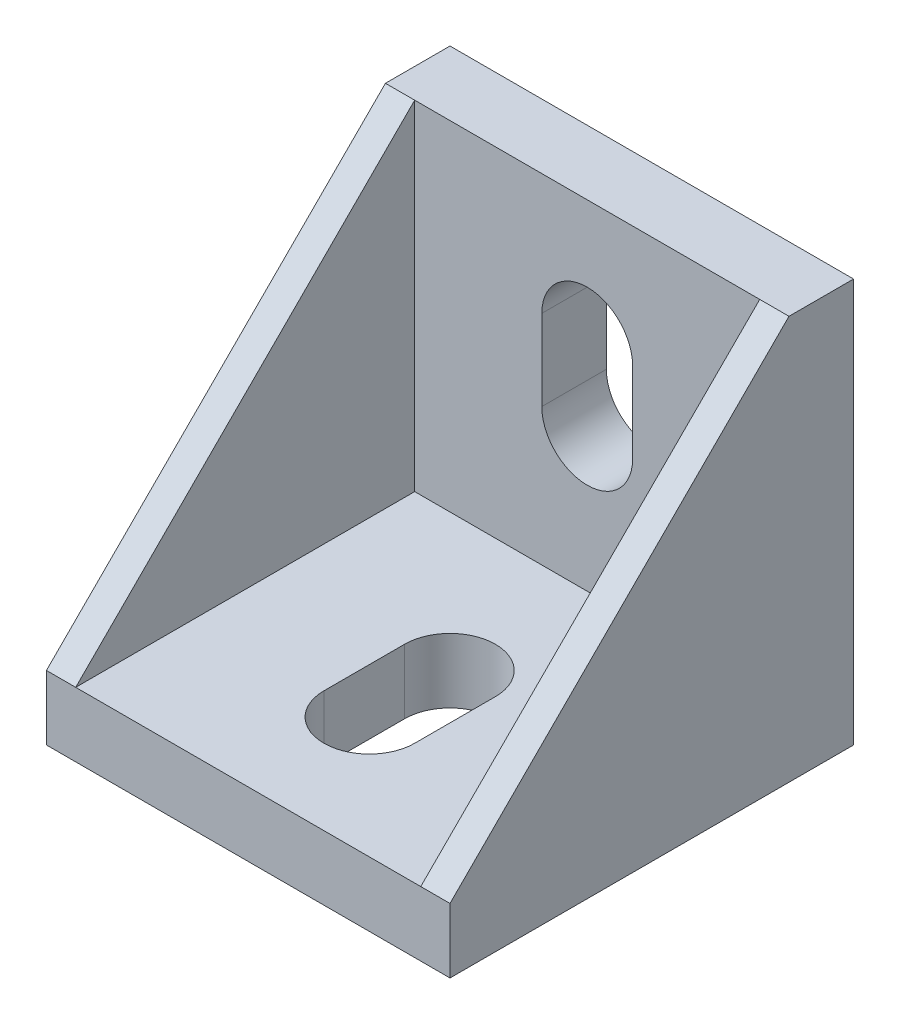
ISO-10303-21;
HEADER;
FILE_DESCRIPTION(('STEP AP214'),'2;1');
FILE_NAME('part.step','',(''),(''),'','','');
FILE_SCHEMA(('AUTOMOTIVE_DESIGN { 1 0 10303 214 1 1 1 1 }'));
ENDSEC;
DATA;
#1=APPLICATION_CONTEXT('core data for automotive mechanical design processes');
#2=APPLICATION_PROTOCOL_DEFINITION('international standard','automotive_design',2000,#1);
#3=PRODUCT_CONTEXT('',#1,'mechanical');
#4=PRODUCT('Part','Part','',(#3));
#5=PRODUCT_RELATED_PRODUCT_CATEGORY('part','',(#4));
#6=PRODUCT_DEFINITION_FORMATION('','',#4);
#7=PRODUCT_DEFINITION_CONTEXT('part definition',#1,'design');
#8=PRODUCT_DEFINITION('design','',#6,#7);
#9=PRODUCT_DEFINITION_SHAPE('','',#8);
#10=(LENGTH_UNIT() NAMED_UNIT(*) SI_UNIT(.MILLI.,.METRE.));
#11=(NAMED_UNIT(*) PLANE_ANGLE_UNIT() SI_UNIT($,.RADIAN.));
#12=(NAMED_UNIT(*) SI_UNIT($,.STERADIAN.) SOLID_ANGLE_UNIT());
#13=UNCERTAINTY_MEASURE_WITH_UNIT(LENGTH_MEASURE(1.E-05),#10,'distance_accuracy_value','');
#14=(GEOMETRIC_REPRESENTATION_CONTEXT(3) GLOBAL_UNCERTAINTY_ASSIGNED_CONTEXT((#13)) GLOBAL_UNIT_ASSIGNED_CONTEXT((#10,
#11,#12)) REPRESENTATION_CONTEXT('',''));
#15=CARTESIAN_POINT('',(0.,0.,0.));
#16=DIRECTION('',(0.,0.,1.));
#17=DIRECTION('',(1.,0.,0.));
#18=AXIS2_PLACEMENT_3D('',#15,#16,#17);
#19=CARTESIAN_POINT('',(-18.,10.,3.2));
#20=DIRECTION('',(0.,0.707106781186547,0.707106781186547));
#21=DIRECTION('',(0.,-0.707106781186548,0.707106781186548));
#22=AXIS2_PLACEMENT_3D('',#19,#20,#21);
#23=PLANE('',#22);
#24=DIRECTION('',(1.,0.,0.));
#25=VECTOR('',#24,1.);
#26=CARTESIAN_POINT('',(-18.,10.,3.2));
#27=LINE('',#26,#25);
#28=CARTESIAN_POINT('',(8.55,10.,3.2));
#29=VERTEX_POINT('',#28);
#30=CARTESIAN_POINT('',(10.,10.,3.2));
#31=VERTEX_POINT('',#30);
#32=EDGE_CURVE('E246',#29,#31,#27,.T.);
#33=ORIENTED_EDGE('',*,*,#32,.F.);
#34=DIRECTION('',(0.,0.707106781186548,-0.707106781186548));
#35=VECTOR('',#34,1.);
#36=CARTESIAN_POINT('',(8.55,-6.8,20.));
#37=LINE('',#36,#35);
#38=CARTESIAN_POINT('',(8.55,-6.8,20.));
#39=VERTEX_POINT('',#38);
#40=EDGE_CURVE('E218',#39,#29,#37,.T.);
#41=ORIENTED_EDGE('',*,*,#40,.F.);
#42=DIRECTION('',(-1.,0.,0.));
#43=VECTOR('',#42,1.);
#44=CARTESIAN_POINT('',(0.,-6.8,20.));
#45=LINE('',#44,#43);
#46=CARTESIAN_POINT('',(10.,-6.8,20.));
#47=VERTEX_POINT('',#46);
#48=EDGE_CURVE('E11',#47,#39,#45,.T.);
#49=ORIENTED_EDGE('',*,*,#48,.F.);
#50=DIRECTION('',(0.,-0.707106781186548,0.707106781186548));
#51=VECTOR('',#50,1.);
#52=CARTESIAN_POINT('',(10.,10.,3.2));
#53=LINE('',#52,#51);
#54=EDGE_CURVE('E239',#31,#47,#53,.T.);
#55=ORIENTED_EDGE('',*,*,#54,.F.);
#56=EDGE_LOOP('',(#33,#41,#49,#55));
#57=FACE_BOUND('',#56,.T.);
#58=ADVANCED_FACE('F35',(#57),#23,.T.);
#59=CARTESIAN_POINT('',(10.,10.,20.));
#60=DIRECTION('',(-1.,0.,0.));
#61=DIRECTION('',(0.,-1.,0.));
#62=AXIS2_PLACEMENT_3D('',#59,#60,#61);
#63=PLANE('',#62);
#64=ORIENTED_EDGE('',*,*,#54,.T.);
#65=DIRECTION('',(0.,1.,0.));
#66=VECTOR('',#65,1.);
#67=CARTESIAN_POINT('',(10.,10.,20.));
#68=LINE('',#67,#66);
#69=CARTESIAN_POINT('',(10.,-10.,20.));
#70=VERTEX_POINT('',#69);
#71=EDGE_CURVE('E254',#70,#47,#68,.T.);
#72=ORIENTED_EDGE('',*,*,#71,.F.);
#73=DIRECTION('',(0.,0.,-1.));
#74=VECTOR('',#73,1.);
#75=CARTESIAN_POINT('',(10.,-10.,20.));
#76=LINE('',#75,#74);
#77=CARTESIAN_POINT('',(10.,-10.,0.));
#78=VERTEX_POINT('',#77);
#79=EDGE_CURVE('E262',#70,#78,#76,.T.);
#80=ORIENTED_EDGE('',*,*,#79,.T.);
#81=DIRECTION('',(0.,1.,0.));
#82=VECTOR('',#81,1.);
#83=CARTESIAN_POINT('',(10.,10.,0.));
#84=LINE('',#83,#82);
#85=CARTESIAN_POINT('',(10.,10.,0.));
#86=VERTEX_POINT('',#85);
#87=EDGE_CURVE('E253',#78,#86,#84,.T.);
#88=ORIENTED_EDGE('',*,*,#87,.T.);
#89=DIRECTION('',(0.,0.,-1.));
#90=VECTOR('',#89,1.);
#91=CARTESIAN_POINT('',(10.,10.,20.));
#92=LINE('',#91,#90);
#93=EDGE_CURVE('E277',#31,#86,#92,.T.);
#94=ORIENTED_EDGE('',*,*,#93,.F.);
#95=EDGE_LOOP('',(#64,#72,#80,#88,#94));
#96=FACE_BOUND('',#95,.T.);
#97=ADVANCED_FACE('F37',(#96),#63,.F.);
#98=CARTESIAN_POINT('',(-10.,10.,20.));
#99=DIRECTION('',(0.,-1.,0.));
#100=DIRECTION('',(0.,0.,-1.));
#101=AXIS2_PLACEMENT_3D('',#98,#99,#100);
#102=PLANE('',#101);
#103=CARTESIAN_POINT('',(-10.,10.,3.2));
#104=VERTEX_POINT('',#103);
#105=CARTESIAN_POINT('',(-8.55,10.,3.2));
#106=VERTEX_POINT('',#105);
#107=EDGE_CURVE('E247',#104,#106,#27,.T.);
#108=ORIENTED_EDGE('',*,*,#107,.T.);
#109=DIRECTION('',(-1.,0.,0.));
#110=VECTOR('',#109,1.);
#111=CARTESIAN_POINT('',(8.55,10.,3.2));
#112=LINE('',#111,#110);
#113=EDGE_CURVE('E228',#29,#106,#112,.T.);
#114=ORIENTED_EDGE('',*,*,#113,.F.);
#115=ORIENTED_EDGE('',*,*,#32,.T.);
#116=ORIENTED_EDGE('',*,*,#93,.T.);
#117=DIRECTION('',(-1.,0.,0.));
#118=VECTOR('',#117,1.);
#119=CARTESIAN_POINT('',(-10.,10.,0.));
#120=LINE('',#119,#118);
#121=CARTESIAN_POINT('',(-10.,10.,0.));
#122=VERTEX_POINT('',#121);
#123=EDGE_CURVE('E265',#86,#122,#120,.T.);
#124=ORIENTED_EDGE('',*,*,#123,.T.);
#125=DIRECTION('',(0.,0.,-1.));
#126=VECTOR('',#125,1.);
#127=CARTESIAN_POINT('',(-10.,10.,20.));
#128=LINE('',#127,#126);
#129=EDGE_CURVE('E276',#104,#122,#128,.T.);
#130=ORIENTED_EDGE('',*,*,#129,.F.);
#131=EDGE_LOOP('',(#108,#114,#115,#116,#124,#130));
#132=FACE_BOUND('',#131,.T.);
#133=ADVANCED_FACE('F312',(#132),#102,.F.);
#134=CARTESIAN_POINT('',(-10.,10.,20.));
#135=DIRECTION('',(1.,0.,0.));
#136=DIRECTION('',(0.,1.,0.));
#137=AXIS2_PLACEMENT_3D('',#134,#135,#136);
#138=PLANE('',#137);
#139=DIRECTION('',(0.,-0.707106781186548,0.707106781186548));
#140=VECTOR('',#139,1.);
#141=CARTESIAN_POINT('',(-10.,1.6,11.6));
#142=LINE('',#141,#140);
#143=CARTESIAN_POINT('',(-10.,-6.8,20.));
#144=VERTEX_POINT('',#143);
#145=EDGE_CURVE('E250',#104,#144,#142,.T.);
#146=ORIENTED_EDGE('',*,*,#145,.F.);
#147=ORIENTED_EDGE('',*,*,#129,.T.);
#148=DIRECTION('',(0.,-1.,0.));
#149=VECTOR('',#148,1.);
#150=CARTESIAN_POINT('',(-10.,10.,0.));
#151=LINE('',#150,#149);
#152=CARTESIAN_POINT('',(-10.,-10.,0.));
#153=VERTEX_POINT('',#152);
#154=EDGE_CURVE('E268',#122,#153,#151,.T.);
#155=ORIENTED_EDGE('',*,*,#154,.T.);
#156=DIRECTION('',(0.,0.,-1.));
#157=VECTOR('',#156,1.);
#158=CARTESIAN_POINT('',(-10.,-10.,20.));
#159=LINE('',#158,#157);
#160=CARTESIAN_POINT('',(-10.,-10.,20.));
#161=VERTEX_POINT('',#160);
#162=EDGE_CURVE('E273',#161,#153,#159,.T.);
#163=ORIENTED_EDGE('',*,*,#162,.F.);
#164=DIRECTION('',(0.,-1.,0.));
#165=VECTOR('',#164,1.);
#166=CARTESIAN_POINT('',(-10.,10.,20.));
#167=LINE('',#166,#165);
#168=EDGE_CURVE('E257',#144,#161,#167,.T.);
#169=ORIENTED_EDGE('',*,*,#168,.F.);
#170=EDGE_LOOP('',(#146,#147,#155,#163,#169));
#171=FACE_BOUND('',#170,.T.);
#172=ADVANCED_FACE('F291',(#171),#138,.F.);
#173=CARTESIAN_POINT('',(0.,0.,20.));
#174=DIRECTION('',(0.,0.,1.));
#175=DIRECTION('',(1.,0.,0.));
#176=AXIS2_PLACEMENT_3D('',#173,#174,#175);
#177=PLANE('',#176);
#178=ORIENTED_EDGE('',*,*,#71,.T.);
#179=ORIENTED_EDGE('',*,*,#48,.T.);
#180=DIRECTION('',(-1.,0.,0.));
#181=VECTOR('',#180,1.);
#182=CARTESIAN_POINT('',(8.55,-6.8,20.));
#183=LINE('',#182,#181);
#184=CARTESIAN_POINT('',(-8.55,-6.8,20.));
#185=VERTEX_POINT('',#184);
#186=EDGE_CURVE('E236',#39,#185,#183,.T.);
#187=ORIENTED_EDGE('',*,*,#186,.T.);
#188=EDGE_CURVE('E43',#185,#144,#45,.T.);
#189=ORIENTED_EDGE('',*,*,#188,.T.);
#190=ORIENTED_EDGE('',*,*,#168,.T.);
#191=DIRECTION('',(1.,0.,0.));
#192=VECTOR('',#191,1.);
#193=CARTESIAN_POINT('',(-10.,-10.,20.));
#194=LINE('',#193,#192);
#195=EDGE_CURVE('E260',#161,#70,#194,.T.);
#196=ORIENTED_EDGE('',*,*,#195,.T.);
#197=EDGE_LOOP('',(#178,#179,#187,#189,#190,#196));
#198=FACE_BOUND('',#197,.T.);
#199=ADVANCED_FACE('F283',(#198),#177,.T.);
#200=CARTESIAN_POINT('',(-10.,-10.,20.));
#201=DIRECTION('',(0.,1.,0.));
#202=DIRECTION('',(0.,0.,1.));
#203=AXIS2_PLACEMENT_3D('',#200,#201,#202);
#204=PLANE('',#203);
#205=DIRECTION('',(0.,0.,-1.));
#206=VECTOR('',#205,1.);
#207=CARTESIAN_POINT('',(2.25,-10.,20.));
#208=LINE('',#207,#206);
#209=CARTESIAN_POINT('',(2.25,-10.,14.));
#210=VERTEX_POINT('',#209);
#211=CARTESIAN_POINT('',(2.25,-10.,10.));
#212=VERTEX_POINT('',#211);
#213=EDGE_CURVE('E179',#210,#212,#208,.T.);
#214=ORIENTED_EDGE('',*,*,#213,.T.);
#215=CARTESIAN_POINT('',(0.,-10.,10.));
#216=DIRECTION('',(0.,1.,0.));
#217=DIRECTION('',(0.,0.,1.));
#218=AXIS2_PLACEMENT_3D('',#215,#216,#217);
#219=CIRCLE('',#218,2.25);
#220=CARTESIAN_POINT('',(-2.25,-10.,10.));
#221=VERTEX_POINT('',#220);
#222=EDGE_CURVE('E182',#212,#221,#219,.T.);
#223=ORIENTED_EDGE('',*,*,#222,.T.);
#224=DIRECTION('',(0.,0.,1.));
#225=VECTOR('',#224,1.);
#226=CARTESIAN_POINT('',(-2.25,-10.,20.));
#227=LINE('',#226,#225);
#228=CARTESIAN_POINT('',(-2.25,-10.,14.));
#229=VERTEX_POINT('',#228);
#230=EDGE_CURVE('E174',#221,#229,#227,.T.);
#231=ORIENTED_EDGE('',*,*,#230,.T.);
#232=CARTESIAN_POINT('',(0.,-10.,14.));
#233=DIRECTION('',(0.,1.,0.));
#234=DIRECTION('',(0.,0.,1.));
#235=AXIS2_PLACEMENT_3D('',#232,#233,#234);
#236=CIRCLE('',#235,2.25);
#237=EDGE_CURVE('E154',#229,#210,#236,.T.);
#238=ORIENTED_EDGE('',*,*,#237,.T.);
#239=EDGE_LOOP('',(#214,#223,#231,#238));
#240=FACE_BOUND('',#239,.T.);
#241=DIRECTION('',(1.,0.,0.));
#242=VECTOR('',#241,1.);
#243=CARTESIAN_POINT('',(-10.,-10.,0.));
#244=LINE('',#243,#242);
#245=EDGE_CURVE('E258',#153,#78,#244,.T.);
#246=ORIENTED_EDGE('',*,*,#245,.T.);
#247=ORIENTED_EDGE('',*,*,#79,.F.);
#248=ORIENTED_EDGE('',*,*,#195,.F.);
#249=ORIENTED_EDGE('',*,*,#162,.T.);
#250=EDGE_LOOP('',(#246,#247,#248,#249));
#251=FACE_BOUND('',#250,.T.);
#252=ADVANCED_FACE('F297',(#240,#251),#204,.F.);
#253=CARTESIAN_POINT('',(0.,0.,0.));
#254=DIRECTION('',(0.,0.,1.));
#255=DIRECTION('',(1.,0.,0.));
#256=AXIS2_PLACEMENT_3D('',#253,#254,#255);
#257=PLANE('',#256);
#258=DIRECTION('',(0.,-1.,0.));
#259=VECTOR('',#258,1.);
#260=CARTESIAN_POINT('',(-2.25,0.,0.));
#261=LINE('',#260,#259);
#262=CARTESIAN_POINT('',(-2.25,4.,0.));
#263=VERTEX_POINT('',#262);
#264=CARTESIAN_POINT('',(-2.25,0.,0.));
#265=VERTEX_POINT('',#264);
#266=EDGE_CURVE('E211',#263,#265,#261,.T.);
#267=ORIENTED_EDGE('',*,*,#266,.T.);
#268=CARTESIAN_POINT('',(0.,0.,0.));
#269=DIRECTION('',(0.,0.,1.));
#270=DIRECTION('',(1.,0.,0.));
#271=AXIS2_PLACEMENT_3D('',#268,#269,#270);
#272=CIRCLE('',#271,2.25);
#273=CARTESIAN_POINT('',(2.25,0.,0.));
#274=VERTEX_POINT('',#273);
#275=EDGE_CURVE('E214',#265,#274,#272,.T.);
#276=ORIENTED_EDGE('',*,*,#275,.T.);
#277=DIRECTION('',(0.,1.,0.));
#278=VECTOR('',#277,1.);
#279=CARTESIAN_POINT('',(2.25,0.,0.));
#280=LINE('',#279,#278);
#281=CARTESIAN_POINT('',(2.25,4.,0.));
#282=VERTEX_POINT('',#281);
#283=EDGE_CURVE('E199',#274,#282,#280,.T.);
#284=ORIENTED_EDGE('',*,*,#283,.T.);
#285=CARTESIAN_POINT('',(0.,4.,0.));
#286=DIRECTION('',(0.,0.,1.));
#287=DIRECTION('',(1.,0.,0.));
#288=AXIS2_PLACEMENT_3D('',#285,#286,#287);
#289=CIRCLE('',#288,2.25);
#290=EDGE_CURVE('E208',#282,#263,#289,.T.);
#291=ORIENTED_EDGE('',*,*,#290,.T.);
#292=EDGE_LOOP('',(#267,#276,#284,#291));
#293=FACE_BOUND('',#292,.T.);
#294=ORIENTED_EDGE('',*,*,#87,.F.);
#295=ORIENTED_EDGE('',*,*,#245,.F.);
#296=ORIENTED_EDGE('',*,*,#154,.F.);
#297=ORIENTED_EDGE('',*,*,#123,.F.);
#298=EDGE_LOOP('',(#294,#295,#296,#297));
#299=FACE_BOUND('',#298,.T.);
#300=ADVANCED_FACE('F314',(#293,#299),#257,.F.);
#301=DIRECTION('',(0.,0.707106781186548,-0.707106781186548));
#302=VECTOR('',#301,1.);
#303=CARTESIAN_POINT('',(-8.55,-6.8,20.));
#304=LINE('',#303,#302);
#305=EDGE_CURVE('E217',#185,#106,#304,.T.);
#306=ORIENTED_EDGE('',*,*,#305,.T.);
#307=ORIENTED_EDGE('',*,*,#107,.F.);
#308=ORIENTED_EDGE('',*,*,#145,.T.);
#309=ORIENTED_EDGE('',*,*,#188,.F.);
#310=EDGE_LOOP('',(#306,#307,#308,#309));
#311=FACE_BOUND('',#310,.T.);
#312=ADVANCED_FACE('F288',(#311),#23,.T.);
#313=CARTESIAN_POINT('',(8.55,-6.8,3.2));
#314=DIRECTION('',(0.,-1.,0.));
#315=DIRECTION('',(0.,0.,-1.));
#316=AXIS2_PLACEMENT_3D('',#313,#314,#315);
#317=PLANE('',#316);
#318=DIRECTION('',(0.,0.,1.));
#319=VECTOR('',#318,1.);
#320=CARTESIAN_POINT('',(-2.25,-6.8,10.));
#321=LINE('',#320,#319);
#322=CARTESIAN_POINT('',(-2.25,-6.8,10.));
#323=VERTEX_POINT('',#322);
#324=CARTESIAN_POINT('',(-2.25,-6.8,14.));
#325=VERTEX_POINT('',#324);
#326=EDGE_CURVE('E160',#323,#325,#321,.T.);
#327=ORIENTED_EDGE('',*,*,#326,.F.);
#328=CARTESIAN_POINT('',(0.,-6.8,10.));
#329=DIRECTION('',(0.,1.,0.));
#330=DIRECTION('',(0.,0.,1.));
#331=AXIS2_PLACEMENT_3D('',#328,#329,#330);
#332=CIRCLE('',#331,2.25);
#333=CARTESIAN_POINT('',(2.25,-6.8,10.));
#334=VERTEX_POINT('',#333);
#335=EDGE_CURVE('E58',#334,#323,#332,.T.);
#336=ORIENTED_EDGE('',*,*,#335,.F.);
#337=DIRECTION('',(0.,0.,-1.));
#338=VECTOR('',#337,1.);
#339=CARTESIAN_POINT('',(2.25,-6.8,10.));
#340=LINE('',#339,#338);
#341=CARTESIAN_POINT('',(2.25,-6.8,14.));
#342=VERTEX_POINT('',#341);
#343=EDGE_CURVE('E167',#342,#334,#340,.T.);
#344=ORIENTED_EDGE('',*,*,#343,.F.);
#345=CARTESIAN_POINT('',(0.,-6.8,14.));
#346=DIRECTION('',(0.,1.,0.));
#347=DIRECTION('',(0.,0.,1.));
#348=AXIS2_PLACEMENT_3D('',#345,#346,#347);
#349=CIRCLE('',#348,2.25);
#350=EDGE_CURVE('E151',#325,#342,#349,.T.);
#351=ORIENTED_EDGE('',*,*,#350,.F.);
#352=EDGE_LOOP('',(#327,#336,#344,#351));
#353=FACE_BOUND('',#352,.T.);
#354=DIRECTION('',(0.,0.,1.));
#355=VECTOR('',#354,1.);
#356=CARTESIAN_POINT('',(-8.55,-6.8,3.2));
#357=LINE('',#356,#355);
#358=CARTESIAN_POINT('',(-8.55,-6.8,3.2));
#359=VERTEX_POINT('',#358);
#360=EDGE_CURVE('E222',#359,#185,#357,.T.);
#361=ORIENTED_EDGE('',*,*,#360,.T.);
#362=ORIENTED_EDGE('',*,*,#186,.F.);
#363=DIRECTION('',(0.,0.,1.));
#364=VECTOR('',#363,1.);
#365=CARTESIAN_POINT('',(8.55,-6.8,3.2));
#366=LINE('',#365,#364);
#367=CARTESIAN_POINT('',(8.55,-6.8,3.2));
#368=VERTEX_POINT('',#367);
#369=EDGE_CURVE('E225',#368,#39,#366,.T.);
#370=ORIENTED_EDGE('',*,*,#369,.F.);
#371=DIRECTION('',(-1.,0.,0.));
#372=VECTOR('',#371,1.);
#373=CARTESIAN_POINT('',(8.55,-6.8,3.2));
#374=LINE('',#373,#372);
#375=EDGE_CURVE('E240',#368,#359,#374,.T.);
#376=ORIENTED_EDGE('',*,*,#375,.T.);
#377=EDGE_LOOP('',(#361,#362,#370,#376));
#378=FACE_BOUND('',#377,.T.);
#379=ADVANCED_FACE('F164',(#353,#378),#317,.F.);
#380=CARTESIAN_POINT('',(8.55,10.,3.2));
#381=DIRECTION('',(0.,0.,-1.));
#382=DIRECTION('',(0.,1.,0.));
#383=AXIS2_PLACEMENT_3D('',#380,#381,#382);
#384=PLANE('',#383);
#385=DIRECTION('',(0.,1.,0.));
#386=VECTOR('',#385,1.);
#387=CARTESIAN_POINT('',(2.25,0.,3.2));
#388=LINE('',#387,#386);
#389=CARTESIAN_POINT('',(2.25,0.,3.2));
#390=VERTEX_POINT('',#389);
#391=CARTESIAN_POINT('',(2.25,4.,3.2));
#392=VERTEX_POINT('',#391);
#393=EDGE_CURVE('E187',#390,#392,#388,.T.);
#394=ORIENTED_EDGE('',*,*,#393,.F.);
#395=CARTESIAN_POINT('',(0.,0.,3.2));
#396=DIRECTION('',(0.,0.,1.));
#397=DIRECTION('',(1.,0.,0.));
#398=AXIS2_PLACEMENT_3D('',#395,#396,#397);
#399=CIRCLE('',#398,2.25);
#400=CARTESIAN_POINT('',(-2.25,0.,3.2));
#401=VERTEX_POINT('',#400);
#402=EDGE_CURVE('E185',#401,#390,#399,.T.);
#403=ORIENTED_EDGE('',*,*,#402,.F.);
#404=DIRECTION('',(0.,-1.,0.));
#405=VECTOR('',#404,1.);
#406=CARTESIAN_POINT('',(-2.25,0.,3.2));
#407=LINE('',#406,#405);
#408=CARTESIAN_POINT('',(-2.25,4.,3.2));
#409=VERTEX_POINT('',#408);
#410=EDGE_CURVE('E193',#409,#401,#407,.T.);
#411=ORIENTED_EDGE('',*,*,#410,.F.);
#412=CARTESIAN_POINT('',(0.,4.,3.2));
#413=DIRECTION('',(0.,0.,1.));
#414=DIRECTION('',(1.,0.,0.));
#415=AXIS2_PLACEMENT_3D('',#412,#413,#414);
#416=CIRCLE('',#415,2.25);
#417=EDGE_CURVE('E190',#392,#409,#416,.T.);
#418=ORIENTED_EDGE('',*,*,#417,.F.);
#419=EDGE_LOOP('',(#394,#403,#411,#418));
#420=FACE_BOUND('',#419,.T.);
#421=DIRECTION('',(0.,-1.,0.));
#422=VECTOR('',#421,1.);
#423=CARTESIAN_POINT('',(-8.55,10.,3.2));
#424=LINE('',#423,#422);
#425=EDGE_CURVE('E231',#106,#359,#424,.T.);
#426=ORIENTED_EDGE('',*,*,#425,.T.);
#427=ORIENTED_EDGE('',*,*,#375,.F.);
#428=DIRECTION('',(0.,-1.,0.));
#429=VECTOR('',#428,1.);
#430=CARTESIAN_POINT('',(8.55,10.,3.2));
#431=LINE('',#430,#429);
#432=EDGE_CURVE('E221',#29,#368,#431,.T.);
#433=ORIENTED_EDGE('',*,*,#432,.F.);
#434=ORIENTED_EDGE('',*,*,#113,.T.);
#435=EDGE_LOOP('',(#426,#427,#433,#434));
#436=FACE_BOUND('',#435,.T.);
#437=ADVANCED_FACE('F331',(#420,#436),#384,.F.);
#438=CARTESIAN_POINT('',(8.55,0.,0.));
#439=DIRECTION('',(-1.,0.,0.));
#440=DIRECTION('',(0.,-1.,0.));
#441=AXIS2_PLACEMENT_3D('',#438,#439,#440);
#442=PLANE('',#441);
#443=ORIENTED_EDGE('',*,*,#40,.T.);
#444=ORIENTED_EDGE('',*,*,#432,.T.);
#445=ORIENTED_EDGE('',*,*,#369,.T.);
#446=EDGE_LOOP('',(#443,#444,#445));
#447=FACE_BOUND('',#446,.T.);
#448=ADVANCED_FACE('F307',(#447),#442,.T.);
#449=CARTESIAN_POINT('',(-8.55,0.,0.));
#450=DIRECTION('',(-1.,0.,0.));
#451=DIRECTION('',(0.,-1.,0.));
#452=AXIS2_PLACEMENT_3D('',#449,#450,#451);
#453=PLANE('',#452);
#454=ORIENTED_EDGE('',*,*,#305,.F.);
#455=ORIENTED_EDGE('',*,*,#360,.F.);
#456=ORIENTED_EDGE('',*,*,#425,.F.);
#457=EDGE_LOOP('',(#454,#455,#456));
#458=FACE_BOUND('',#457,.T.);
#459=ADVANCED_FACE('F311',(#458),#453,.F.);
#460=CARTESIAN_POINT('',(0.,0.,-13.9));
#461=DIRECTION('',(0.,0.,1.));
#462=DIRECTION('',(1.,0.,0.));
#463=AXIS2_PLACEMENT_3D('',#460,#461,#462);
#464=CYLINDRICAL_SURFACE('',#463,2.25);
#465=DIRECTION('',(0.,0.,1.));
#466=VECTOR('',#465,1.);
#467=CARTESIAN_POINT('',(-2.25,0.,-13.9));
#468=LINE('',#467,#466);
#469=EDGE_CURVE('E197',#265,#401,#468,.T.);
#470=ORIENTED_EDGE('',*,*,#469,.T.);
#471=ORIENTED_EDGE('',*,*,#402,.T.);
#472=DIRECTION('',(0.,0.,1.));
#473=VECTOR('',#472,1.);
#474=CARTESIAN_POINT('',(2.25,0.,-13.9));
#475=LINE('',#474,#473);
#476=EDGE_CURVE('E196',#274,#390,#475,.T.);
#477=ORIENTED_EDGE('',*,*,#476,.F.);
#478=ORIENTED_EDGE('',*,*,#275,.F.);
#479=EDGE_LOOP('',(#470,#471,#477,#478));
#480=FACE_BOUND('',#479,.T.);
#481=ADVANCED_FACE('F393',(#480),#464,.F.);
#482=CARTESIAN_POINT('',(-2.25,0.,-13.9));
#483=DIRECTION('',(-1.,0.,0.));
#484=DIRECTION('',(0.,0.,1.));
#485=AXIS2_PLACEMENT_3D('',#482,#483,#484);
#486=PLANE('',#485);
#487=DIRECTION('',(0.,0.,1.));
#488=VECTOR('',#487,1.);
#489=CARTESIAN_POINT('',(-2.25,4.,-13.9));
#490=LINE('',#489,#488);
#491=EDGE_CURVE('E200',#263,#409,#490,.T.);
#492=ORIENTED_EDGE('',*,*,#491,.T.);
#493=ORIENTED_EDGE('',*,*,#410,.T.);
#494=ORIENTED_EDGE('',*,*,#469,.F.);
#495=ORIENTED_EDGE('',*,*,#266,.F.);
#496=EDGE_LOOP('',(#492,#493,#494,#495));
#497=FACE_BOUND('',#496,.T.);
#498=ADVANCED_FACE('F400',(#497),#486,.F.);
#499=CARTESIAN_POINT('',(0.,4.,-13.9));
#500=DIRECTION('',(0.,0.,1.));
#501=DIRECTION('',(1.,0.,0.));
#502=AXIS2_PLACEMENT_3D('',#499,#500,#501);
#503=CYLINDRICAL_SURFACE('',#502,2.25);
#504=DIRECTION('',(0.,0.,1.));
#505=VECTOR('',#504,1.);
#506=CARTESIAN_POINT('',(2.25,4.,-13.9));
#507=LINE('',#506,#505);
#508=EDGE_CURVE('E202',#282,#392,#507,.T.);
#509=ORIENTED_EDGE('',*,*,#508,.T.);
#510=ORIENTED_EDGE('',*,*,#417,.T.);
#511=ORIENTED_EDGE('',*,*,#491,.F.);
#512=ORIENTED_EDGE('',*,*,#290,.F.);
#513=EDGE_LOOP('',(#509,#510,#511,#512));
#514=FACE_BOUND('',#513,.T.);
#515=ADVANCED_FACE('F409',(#514),#503,.F.);
#516=CARTESIAN_POINT('',(2.25,0.,-13.9));
#517=DIRECTION('',(1.,0.,0.));
#518=DIRECTION('',(0.,0.,-1.));
#519=AXIS2_PLACEMENT_3D('',#516,#517,#518);
#520=PLANE('',#519);
#521=ORIENTED_EDGE('',*,*,#476,.T.);
#522=ORIENTED_EDGE('',*,*,#393,.T.);
#523=ORIENTED_EDGE('',*,*,#508,.F.);
#524=ORIENTED_EDGE('',*,*,#283,.F.);
#525=EDGE_LOOP('',(#521,#522,#523,#524));
#526=FACE_BOUND('',#525,.T.);
#527=ADVANCED_FACE('F418',(#526),#520,.F.);
#528=CARTESIAN_POINT('',(0.,-23.9,10.));
#529=DIRECTION('',(0.,1.,0.));
#530=DIRECTION('',(0.,0.,1.));
#531=AXIS2_PLACEMENT_3D('',#528,#529,#530);
#532=CYLINDRICAL_SURFACE('',#531,2.25);
#533=DIRECTION('',(0.,1.,0.));
#534=VECTOR('',#533,1.);
#535=CARTESIAN_POINT('',(2.25,-23.9,10.));
#536=LINE('',#535,#534);
#537=EDGE_CURVE('E172',#212,#334,#536,.T.);
#538=ORIENTED_EDGE('',*,*,#537,.T.);
#539=ORIENTED_EDGE('',*,*,#335,.T.);
#540=DIRECTION('',(0.,1.,0.));
#541=VECTOR('',#540,1.);
#542=CARTESIAN_POINT('',(-2.25,-23.9,10.));
#543=LINE('',#542,#541);
#544=EDGE_CURVE('E157',#221,#323,#543,.T.);
#545=ORIENTED_EDGE('',*,*,#544,.F.);
#546=ORIENTED_EDGE('',*,*,#222,.F.);
#547=EDGE_LOOP('',(#538,#539,#545,#546));
#548=FACE_BOUND('',#547,.T.);
#549=ADVANCED_FACE('F427',(#548),#532,.F.);
#550=CARTESIAN_POINT('',(2.25,-23.9,10.));
#551=DIRECTION('',(1.,0.,0.));
#552=DIRECTION('',(0.,0.,-1.));
#553=AXIS2_PLACEMENT_3D('',#550,#551,#552);
#554=PLANE('',#553);
#555=DIRECTION('',(0.,1.,0.));
#556=VECTOR('',#555,1.);
#557=CARTESIAN_POINT('',(2.25,-23.9,14.));
#558=LINE('',#557,#556);
#559=EDGE_CURVE('E156',#210,#342,#558,.T.);
#560=ORIENTED_EDGE('',*,*,#559,.T.);
#561=ORIENTED_EDGE('',*,*,#343,.T.);
#562=ORIENTED_EDGE('',*,*,#537,.F.);
#563=ORIENTED_EDGE('',*,*,#213,.F.);
#564=EDGE_LOOP('',(#560,#561,#562,#563));
#565=FACE_BOUND('',#564,.T.);
#566=ADVANCED_FACE('F435',(#565),#554,.F.);
#567=CARTESIAN_POINT('',(0.,-23.9,14.));
#568=DIRECTION('',(0.,1.,0.));
#569=DIRECTION('',(0.,0.,1.));
#570=AXIS2_PLACEMENT_3D('',#567,#568,#569);
#571=CYLINDRICAL_SURFACE('',#570,2.25);
#572=DIRECTION('',(0.,1.,0.));
#573=VECTOR('',#572,1.);
#574=CARTESIAN_POINT('',(-2.25,-23.9,14.));
#575=LINE('',#574,#573);
#576=EDGE_CURVE('E50',#229,#325,#575,.T.);
#577=ORIENTED_EDGE('',*,*,#576,.T.);
#578=ORIENTED_EDGE('',*,*,#350,.T.);
#579=ORIENTED_EDGE('',*,*,#559,.F.);
#580=ORIENTED_EDGE('',*,*,#237,.F.);
#581=EDGE_LOOP('',(#577,#578,#579,#580));
#582=FACE_BOUND('',#581,.T.);
#583=ADVANCED_FACE('F148',(#582),#571,.F.);
#584=CARTESIAN_POINT('',(-2.25,-23.9,10.));
#585=DIRECTION('',(-1.,0.,0.));
#586=DIRECTION('',(0.,-1.,0.));
#587=AXIS2_PLACEMENT_3D('',#584,#585,#586);
#588=PLANE('',#587);
#589=ORIENTED_EDGE('',*,*,#544,.T.);
#590=ORIENTED_EDGE('',*,*,#326,.T.);
#591=ORIENTED_EDGE('',*,*,#576,.F.);
#592=ORIENTED_EDGE('',*,*,#230,.F.);
#593=EDGE_LOOP('',(#589,#590,#591,#592));
#594=FACE_BOUND('',#593,.T.);
#595=ADVANCED_FACE('F161',(#594),#588,.F.);
#596=CLOSED_SHELL('',(#58,#97,#133,#172,#199,#252,#300,#312,#379,#437,#448,#459,#481,#498,#515,
#527,#549,#566,#583,#595));
#597=MANIFOLD_SOLID_BREP('B2',#596);
#598=ADVANCED_BREP_SHAPE_REPRESENTATION('',(#18,#597),#14);
#599=SHAPE_DEFINITION_REPRESENTATION(#9,#598);
ENDSEC;
END-ISO-10303-21;
